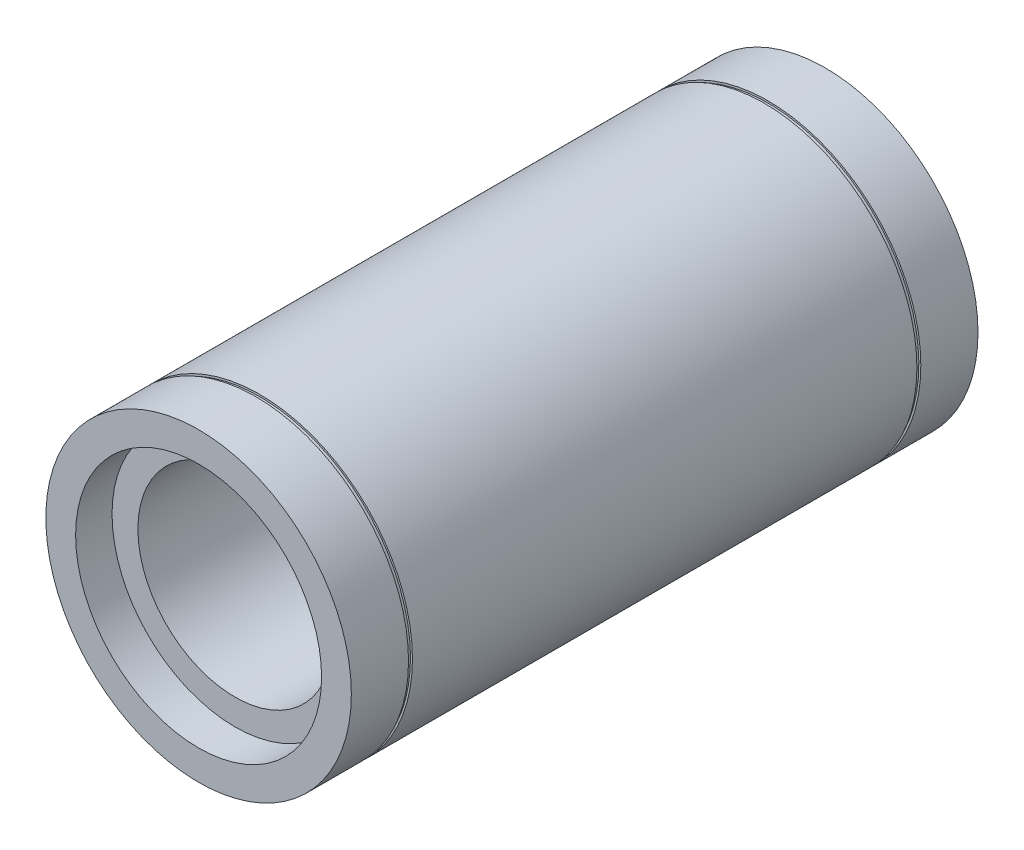
ISO-10303-21;
HEADER;
FILE_DESCRIPTION(('STEP AP214'),'2;1');
FILE_NAME('part.step','',(''),(''),'','','');
FILE_SCHEMA(('AUTOMOTIVE_DESIGN { 1 0 10303 214 1 1 1 1 }'));
ENDSEC;
DATA;
#1=APPLICATION_CONTEXT('core data for automotive mechanical design processes');
#2=APPLICATION_PROTOCOL_DEFINITION('international standard','automotive_design',2000,#1);
#3=PRODUCT_CONTEXT('',#1,'mechanical');
#4=PRODUCT('Part','Part','',(#3));
#5=PRODUCT_RELATED_PRODUCT_CATEGORY('part','',(#4));
#6=PRODUCT_DEFINITION_FORMATION('','',#4);
#7=PRODUCT_DEFINITION_CONTEXT('part definition',#1,'design');
#8=PRODUCT_DEFINITION('design','',#6,#7);
#9=PRODUCT_DEFINITION_SHAPE('','',#8);
#10=(LENGTH_UNIT() NAMED_UNIT(*) SI_UNIT(.MILLI.,.METRE.));
#11=(NAMED_UNIT(*) PLANE_ANGLE_UNIT() SI_UNIT($,.RADIAN.));
#12=(NAMED_UNIT(*) SI_UNIT($,.STERADIAN.) SOLID_ANGLE_UNIT());
#13=UNCERTAINTY_MEASURE_WITH_UNIT(LENGTH_MEASURE(1.E-05),#10,'distance_accuracy_value','');
#14=(GEOMETRIC_REPRESENTATION_CONTEXT(3) GLOBAL_UNCERTAINTY_ASSIGNED_CONTEXT((#13)) GLOBAL_UNIT_ASSIGNED_CONTEXT((#10,
#11,#12)) REPRESENTATION_CONTEXT('',''));
#15=CARTESIAN_POINT('',(0.,0.,0.));
#16=DIRECTION('',(0.,0.,1.));
#17=DIRECTION('',(1.,0.,0.));
#18=AXIS2_PLACEMENT_3D('',#15,#16,#17);
#19=CARTESIAN_POINT('',(0.,0.,16.));
#20=DIRECTION('',(0.,0.,-1.));
#21=DIRECTION('',(-1.,0.,0.));
#22=AXIS2_PLACEMENT_3D('',#19,#20,#21);
#23=CYLINDRICAL_SURFACE('',#22,2.48);
#24=CARTESIAN_POINT('',(0.,0.,0.93));
#25=DIRECTION('',(0.,0.,1.));
#26=DIRECTION('',(1.,0.,0.));
#27=AXIS2_PLACEMENT_3D('',#24,#25,#26);
#28=CIRCLE('',#27,2.48);
#29=CARTESIAN_POINT('',(2.48,0.,0.93));
#30=VERTEX_POINT('',#29);
#31=EDGE_CURVE('E228',#30,#30,#28,.T.);
#32=ORIENTED_EDGE('',*,*,#31,.F.);
#33=EDGE_LOOP('',(#32));
#34=FACE_BOUND('',#33,.T.);
#35=CARTESIAN_POINT('',(0.,0.,7.07));
#36=DIRECTION('',(0.,0.,1.));
#37=DIRECTION('',(1.,0.,0.));
#38=AXIS2_PLACEMENT_3D('',#35,#36,#37);
#39=CIRCLE('',#38,2.48);
#40=CARTESIAN_POINT('',(2.48,0.,7.07));
#41=VERTEX_POINT('',#40);
#42=EDGE_CURVE('E79',#41,#41,#39,.T.);
#43=ORIENTED_EDGE('',*,*,#42,.T.);
#44=EDGE_LOOP('',(#43));
#45=FACE_BOUND('',#44,.T.);
#46=ADVANCED_FACE('F75',(#34,#45),#23,.F.);
#47=CARTESIAN_POINT('',(0.,0.,15.07));
#48=DIRECTION('',(0.,0.,1.));
#49=DIRECTION('',(1.,0.,0.));
#50=AXIS2_PLACEMENT_3D('',#47,#48,#49);
#51=CIRCLE('',#50,2.48);
#52=CARTESIAN_POINT('',(2.48,0.,15.07));
#53=VERTEX_POINT('',#52);
#54=EDGE_CURVE('E235',#53,#53,#51,.T.);
#55=ORIENTED_EDGE('',*,*,#54,.T.);
#56=EDGE_LOOP('',(#55));
#57=FACE_BOUND('',#56,.T.);
#58=CARTESIAN_POINT('',(0.,0.,8.93));
#59=DIRECTION('',(0.,0.,-1.));
#60=DIRECTION('',(-1.,0.,0.));
#61=AXIS2_PLACEMENT_3D('',#58,#59,#60);
#62=CIRCLE('',#61,2.48);
#63=CARTESIAN_POINT('',(-2.48,0.,8.93));
#64=VERTEX_POINT('',#63);
#65=EDGE_CURVE('E189',#64,#64,#62,.T.);
#66=ORIENTED_EDGE('',*,*,#65,.T.);
#67=EDGE_LOOP('',(#66));
#68=FACE_BOUND('',#67,.T.);
#69=ADVANCED_FACE('F273',(#57,#68),#23,.F.);
#70=CARTESIAN_POINT('',(0.,0.,0.));
#71=DIRECTION('',(0.,0.,1.));
#72=DIRECTION('',(1.,0.,0.));
#73=AXIS2_PLACEMENT_3D('',#70,#71,#72);
#74=PLANE('',#73);
#75=CARTESIAN_POINT('',(0.,0.,0.));
#76=DIRECTION('',(0.,0.,1.));
#77=DIRECTION('',(1.,0.,0.));
#78=AXIS2_PLACEMENT_3D('',#75,#76,#77);
#79=CIRCLE('',#78,3.9);
#80=CARTESIAN_POINT('',(3.9,0.,0.));
#81=VERTEX_POINT('',#80);
#82=EDGE_CURVE('E84',#81,#81,#79,.T.);
#83=ORIENTED_EDGE('',*,*,#82,.F.);
#84=EDGE_LOOP('',(#83));
#85=FACE_BOUND('',#84,.T.);
#86=CARTESIAN_POINT('',(0.,0.,0.));
#87=DIRECTION('',(0.,0.,1.));
#88=DIRECTION('',(1.,0.,0.));
#89=AXIS2_PLACEMENT_3D('',#86,#87,#88);
#90=CIRCLE('',#89,3.14);
#91=CARTESIAN_POINT('',(3.14,0.,0.));
#92=VERTEX_POINT('',#91);
#93=EDGE_CURVE('E231',#92,#92,#90,.T.);
#94=ORIENTED_EDGE('',*,*,#93,.T.);
#95=EDGE_LOOP('',(#94));
#96=FACE_BOUND('',#95,.T.);
#97=ADVANCED_FACE('F279',(#85,#96),#74,.F.);
#98=CARTESIAN_POINT('',(0.,0.,16.));
#99=DIRECTION('',(0.,0.,1.));
#100=DIRECTION('',(1.,0.,0.));
#101=AXIS2_PLACEMENT_3D('',#98,#99,#100);
#102=PLANE('',#101);
#103=CARTESIAN_POINT('',(0.,0.,16.));
#104=DIRECTION('',(0.,0.,1.));
#105=DIRECTION('',(1.,0.,0.));
#106=AXIS2_PLACEMENT_3D('',#103,#104,#105);
#107=CIRCLE('',#106,3.14);
#108=CARTESIAN_POINT('',(3.14,0.,16.));
#109=VERTEX_POINT('',#108);
#110=EDGE_CURVE('E240',#109,#109,#107,.T.);
#111=ORIENTED_EDGE('',*,*,#110,.F.);
#112=EDGE_LOOP('',(#111));
#113=FACE_BOUND('',#112,.T.);
#114=CARTESIAN_POINT('',(0.,0.,16.));
#115=DIRECTION('',(0.,0.,1.));
#116=DIRECTION('',(1.,0.,0.));
#117=AXIS2_PLACEMENT_3D('',#114,#115,#116);
#118=CIRCLE('',#117,3.9);
#119=CARTESIAN_POINT('',(3.9,0.,16.));
#120=VERTEX_POINT('',#119);
#121=EDGE_CURVE('E13',#120,#120,#118,.T.);
#122=ORIENTED_EDGE('',*,*,#121,.T.);
#123=EDGE_LOOP('',(#122));
#124=FACE_BOUND('',#123,.T.);
#125=ADVANCED_FACE('F286',(#113,#124),#102,.T.);
#126=CARTESIAN_POINT('',(0.,0.,16.));
#127=DIRECTION('',(0.,0.,-1.));
#128=DIRECTION('',(-1.,0.,0.));
#129=AXIS2_PLACEMENT_3D('',#126,#127,#128);
#130=CYLINDRICAL_SURFACE('',#129,3.9);
#131=CARTESIAN_POINT('',(0.,0.,14.54));
#132=DIRECTION('',(0.,0.,-1.));
#133=DIRECTION('',(-0.539347709413305,-0.842083159997052,0.));
#134=AXIS2_PLACEMENT_3D('',#131,#132,#133);
#135=CIRCLE('',#134,3.9);
#136=CARTESIAN_POINT('',(-2.10717899288575,-3.28173684075079,14.54));
#137=VERTEX_POINT('',#136);
#138=CARTESIAN_POINT('',(-2.10345606671189,-3.2841243239885,14.54));
#139=VERTEX_POINT('',#138);
#140=EDGE_CURVE('E175',#137,#139,#135,.T.);
#141=ORIENTED_EDGE('',*,*,#140,.F.);
#142=DIRECTION('',(0.,0.,-1.));
#143=VECTOR('',#142,1.);
#144=CARTESIAN_POINT('',(-2.10717899288574,-3.2817368407508,14.54));
#145=LINE('',#144,#143);
#146=CARTESIAN_POINT('',(-2.10717899288574,-3.2817368407508,14.44));
#147=VERTEX_POINT('',#146);
#148=EDGE_CURVE('E92',#137,#147,#145,.T.);
#149=ORIENTED_EDGE('',*,*,#148,.T.);
#150=CARTESIAN_POINT('',(0.,0.,14.44));
#151=DIRECTION('',(0.,0.,-1.));
#152=DIRECTION('',(-0.539347709413305,-0.842083159997052,0.));
#153=AXIS2_PLACEMENT_3D('',#150,#151,#152);
#154=CIRCLE('',#153,3.9);
#155=CARTESIAN_POINT('',(-2.10345606671189,-3.2841243239885,14.44));
#156=VERTEX_POINT('',#155);
#157=EDGE_CURVE('E148',#147,#156,#154,.T.);
#158=ORIENTED_EDGE('',*,*,#157,.T.);
#159=DIRECTION('',(0.,0.,1.));
#160=VECTOR('',#159,1.);
#161=CARTESIAN_POINT('',(-2.10345606671189,-3.2841243239885,14.44));
#162=LINE('',#161,#160);
#163=EDGE_CURVE('E179',#156,#139,#162,.T.);
#164=ORIENTED_EDGE('',*,*,#163,.T.);
#165=EDGE_LOOP('',(#141,#149,#158,#164));
#166=FACE_BOUND('',#165,.T.);
#167=DIRECTION('',(0.,0.,-1.));
#168=VECTOR('',#167,1.);
#169=CARTESIAN_POINT('',(-2.10717899288574,-3.2817368407508,1.56));
#170=LINE('',#169,#168);
#171=CARTESIAN_POINT('',(-2.10717899288574,-3.2817368407508,1.56));
#172=VERTEX_POINT('',#171);
#173=CARTESIAN_POINT('',(-2.10717899288575,-3.28173684075079,1.46));
#174=VERTEX_POINT('',#173);
#175=EDGE_CURVE('E199',#172,#174,#170,.T.);
#176=ORIENTED_EDGE('',*,*,#175,.T.);
#177=CARTESIAN_POINT('',(0.,0.,1.46));
#178=DIRECTION('',(0.,0.,-1.));
#179=DIRECTION('',(-0.539347709413305,-0.842083159997052,0.));
#180=AXIS2_PLACEMENT_3D('',#177,#178,#179);
#181=CIRCLE('',#180,3.9);
#182=CARTESIAN_POINT('',(-2.10345606671189,-3.2841243239885,1.46));
#183=VERTEX_POINT('',#182);
#184=EDGE_CURVE('E195',#174,#183,#181,.T.);
#185=ORIENTED_EDGE('',*,*,#184,.T.);
#186=DIRECTION('',(0.,0.,1.));
#187=VECTOR('',#186,1.);
#188=CARTESIAN_POINT('',(-2.10345606671189,-3.2841243239885,1.46));
#189=LINE('',#188,#187);
#190=CARTESIAN_POINT('',(-2.10345606671189,-3.2841243239885,1.56));
#191=VERTEX_POINT('',#190);
#192=EDGE_CURVE('E191',#183,#191,#189,.T.);
#193=ORIENTED_EDGE('',*,*,#192,.T.);
#194=CARTESIAN_POINT('',(0.,0.,1.56));
#195=DIRECTION('',(0.,0.,-1.));
#196=DIRECTION('',(-0.539347709413305,-0.842083159997052,0.));
#197=AXIS2_PLACEMENT_3D('',#194,#195,#196);
#198=CIRCLE('',#197,3.9);
#199=EDGE_CURVE('E100',#172,#191,#198,.T.);
#200=ORIENTED_EDGE('',*,*,#199,.F.);
#201=EDGE_LOOP('',(#176,#185,#193,#200));
#202=FACE_BOUND('',#201,.T.);
#203=ORIENTED_EDGE('',*,*,#121,.F.);
#204=EDGE_LOOP('',(#203));
#205=FACE_BOUND('',#204,.T.);
#206=ORIENTED_EDGE('',*,*,#82,.T.);
#207=EDGE_LOOP('',(#206));
#208=FACE_BOUND('',#207,.T.);
#209=ADVANCED_FACE('F77',(#166,#202,#205,#208),#130,.T.);
#210=CARTESIAN_POINT('',(0.,0.,15.07));
#211=DIRECTION('',(0.,0.,1.));
#212=DIRECTION('',(1.,0.,0.));
#213=AXIS2_PLACEMENT_3D('',#210,#211,#212);
#214=CYLINDRICAL_SURFACE('',#213,3.14);
#215=CARTESIAN_POINT('',(0.,0.,15.07));
#216=DIRECTION('',(0.,0.,1.));
#217=DIRECTION('',(1.,0.,0.));
#218=AXIS2_PLACEMENT_3D('',#215,#216,#217);
#219=CIRCLE('',#218,3.14);
#220=CARTESIAN_POINT('',(3.14,0.,15.07));
#221=VERTEX_POINT('',#220);
#222=EDGE_CURVE('E241',#221,#221,#219,.T.);
#223=ORIENTED_EDGE('',*,*,#222,.F.);
#224=EDGE_LOOP('',(#223));
#225=FACE_BOUND('',#224,.T.);
#226=ORIENTED_EDGE('',*,*,#110,.T.);
#227=EDGE_LOOP('',(#226));
#228=FACE_BOUND('',#227,.T.);
#229=ADVANCED_FACE('F284',(#225,#228),#214,.F.);
#230=CARTESIAN_POINT('',(0.,0.,15.07));
#231=DIRECTION('',(0.,0.,1.));
#232=DIRECTION('',(1.,0.,0.));
#233=AXIS2_PLACEMENT_3D('',#230,#231,#232);
#234=PLANE('',#233);
#235=ORIENTED_EDGE('',*,*,#54,.F.);
#236=EDGE_LOOP('',(#235));
#237=FACE_BOUND('',#236,.T.);
#238=ORIENTED_EDGE('',*,*,#222,.T.);
#239=EDGE_LOOP('',(#238));
#240=FACE_BOUND('',#239,.T.);
#241=ADVANCED_FACE('F303',(#237,#240),#234,.T.);
#242=CARTESIAN_POINT('',(0.,0.,0.93));
#243=DIRECTION('',(0.,0.,1.));
#244=DIRECTION('',(1.,0.,0.));
#245=AXIS2_PLACEMENT_3D('',#242,#243,#244);
#246=PLANE('',#245);
#247=CARTESIAN_POINT('',(0.,0.,0.93));
#248=DIRECTION('',(0.,0.,1.));
#249=DIRECTION('',(1.,0.,0.));
#250=AXIS2_PLACEMENT_3D('',#247,#248,#249);
#251=CIRCLE('',#250,3.14);
#252=CARTESIAN_POINT('',(3.14,0.,0.93));
#253=VERTEX_POINT('',#252);
#254=EDGE_CURVE('E232',#253,#253,#251,.T.);
#255=ORIENTED_EDGE('',*,*,#254,.F.);
#256=EDGE_LOOP('',(#255));
#257=FACE_BOUND('',#256,.T.);
#258=ORIENTED_EDGE('',*,*,#31,.T.);
#259=EDGE_LOOP('',(#258));
#260=FACE_BOUND('',#259,.T.);
#261=ADVANCED_FACE('F267',(#257,#260),#246,.F.);
#262=CARTESIAN_POINT('',(0.,0.,0.93));
#263=DIRECTION('',(0.,0.,-1.));
#264=DIRECTION('',(-1.,0.,0.));
#265=AXIS2_PLACEMENT_3D('',#262,#263,#264);
#266=CYLINDRICAL_SURFACE('',#265,3.14);
#267=ORIENTED_EDGE('',*,*,#254,.T.);
#268=EDGE_LOOP('',(#267));
#269=FACE_BOUND('',#268,.T.);
#270=ORIENTED_EDGE('',*,*,#93,.F.);
#271=EDGE_LOOP('',(#270));
#272=FACE_BOUND('',#271,.T.);
#273=ADVANCED_FACE('F258',(#269,#272),#266,.F.);
#274=CARTESIAN_POINT('',(0.,0.,8.));
#275=DIRECTION('',(0.,0.,-1.));
#276=DIRECTION('',(-1.,0.,0.));
#277=AXIS2_PLACEMENT_3D('',#274,#275,#276);
#278=TOROIDAL_SURFACE('',#277,2.48,0.93);
#279=ORIENTED_EDGE('',*,*,#42,.F.);
#280=EDGE_LOOP('',(#279));
#281=FACE_BOUND('',#280,.T.);
#282=ORIENTED_EDGE('',*,*,#65,.F.);
#283=EDGE_LOOP('',(#282));
#284=FACE_BOUND('',#283,.T.);
#285=ADVANCED_FACE('F254',(#281,#284),#278,.F.);
#286=CARTESIAN_POINT('',(0.,0.,1.46));
#287=DIRECTION('',(0.,0.,1.));
#288=DIRECTION('',(1.,0.,0.));
#289=AXIS2_PLACEMENT_3D('',#286,#287,#288);
#290=PLANE('',#289);
#291=DIRECTION('',(-0.539347709413305,-0.842083159997052,0.));
#292=VECTOR('',#291,1.);
#293=CARTESIAN_POINT('',(-2.10345606671189,-3.2841243239885,1.46));
#294=LINE('',#293,#292);
#295=CARTESIAN_POINT('',(-2.07648868124122,-3.24202016598865,1.46));
#296=VERTEX_POINT('',#295);
#297=EDGE_CURVE('E187',#296,#183,#294,.T.);
#298=ORIENTED_EDGE('',*,*,#297,.T.);
#299=ORIENTED_EDGE('',*,*,#184,.F.);
#300=DIRECTION('',(-0.54030230586814,-0.841470984807896,0.));
#301=VECTOR('',#300,1.);
#302=CARTESIAN_POINT('',(-2.10717899288575,-3.28173684075079,1.46));
#303=LINE('',#302,#301);
#304=CARTESIAN_POINT('',(-2.08016387759234,-3.2396632915104,1.46));
#305=VERTEX_POINT('',#304);
#306=EDGE_CURVE('E224',#305,#174,#303,.T.);
#307=ORIENTED_EDGE('',*,*,#306,.F.);
#308=CARTESIAN_POINT('',(0.,0.,1.46));
#309=DIRECTION('',(0.,0.,-1.));
#310=DIRECTION('',(-1.,0.,0.));
#311=AXIS2_PLACEMENT_3D('',#308,#309,#310);
#312=CIRCLE('',#311,3.85);
#313=EDGE_CURVE('E215',#305,#296,#312,.T.);
#314=ORIENTED_EDGE('',*,*,#313,.T.);
#315=EDGE_LOOP('',(#298,#299,#307,#314));
#316=FACE_BOUND('',#315,.T.);
#317=ADVANCED_FACE('F257',(#316),#290,.T.);
#318=CARTESIAN_POINT('',(-2.10717899288574,-3.2817368407508,1.51));
#319=DIRECTION('',(-0.841470984807897,0.54030230586814,0.));
#320=DIRECTION('',(0.,0.,-1.));
#321=AXIS2_PLACEMENT_3D('',#318,#319,#320);
#322=PLANE('',#321);
#323=ORIENTED_EDGE('',*,*,#306,.T.);
#324=ORIENTED_EDGE('',*,*,#175,.F.);
#325=DIRECTION('',(-0.54030230586814,-0.841470984807897,0.));
#326=VECTOR('',#325,1.);
#327=CARTESIAN_POINT('',(-2.10717899288574,-3.2817368407508,1.56));
#328=LINE('',#327,#326);
#329=CARTESIAN_POINT('',(-2.08016387759234,-3.2396632915104,1.56));
#330=VERTEX_POINT('',#329);
#331=EDGE_CURVE('E222',#330,#172,#328,.T.);
#332=ORIENTED_EDGE('',*,*,#331,.F.);
#333=DIRECTION('',(0.,0.,-1.));
#334=VECTOR('',#333,1.);
#335=CARTESIAN_POINT('',(-2.08016387759234,-3.2396632915104,16.));
#336=LINE('',#335,#334);
#337=EDGE_CURVE('E206',#330,#305,#336,.T.);
#338=ORIENTED_EDGE('',*,*,#337,.T.);
#339=EDGE_LOOP('',(#323,#324,#332,#338));
#340=FACE_BOUND('',#339,.T.);
#341=ADVANCED_FACE('F264',(#340),#322,.T.);
#342=CARTESIAN_POINT('',(0.,0.,1.56));
#343=DIRECTION('',(0.,0.,1.));
#344=DIRECTION('',(1.,0.,0.));
#345=AXIS2_PLACEMENT_3D('',#342,#343,#344);
#346=PLANE('',#345);
#347=ORIENTED_EDGE('',*,*,#331,.T.);
#348=ORIENTED_EDGE('',*,*,#199,.T.);
#349=DIRECTION('',(-0.539347709413305,-0.842083159997052,0.));
#350=VECTOR('',#349,1.);
#351=CARTESIAN_POINT('',(-2.10345606671189,-3.2841243239885,1.56));
#352=LINE('',#351,#350);
#353=CARTESIAN_POINT('',(-2.07648868124122,-3.24202016598865,1.56));
#354=VERTEX_POINT('',#353);
#355=EDGE_CURVE('E203',#354,#191,#352,.T.);
#356=ORIENTED_EDGE('',*,*,#355,.F.);
#357=CARTESIAN_POINT('',(0.,0.,1.56));
#358=DIRECTION('',(0.,0.,-1.));
#359=DIRECTION('',(-1.,0.,0.));
#360=AXIS2_PLACEMENT_3D('',#357,#358,#359);
#361=CIRCLE('',#360,3.85);
#362=EDGE_CURVE('E207',#330,#354,#361,.T.);
#363=ORIENTED_EDGE('',*,*,#362,.F.);
#364=EDGE_LOOP('',(#347,#348,#356,#363));
#365=FACE_BOUND('',#364,.T.);
#366=ADVANCED_FACE('F320',(#365),#346,.F.);
#367=CARTESIAN_POINT('',(-2.10345606671189,-3.2841243239885,1.51));
#368=DIRECTION('',(0.842083159997052,-0.539347709413305,0.));
#369=DIRECTION('',(0.,0.,1.));
#370=AXIS2_PLACEMENT_3D('',#367,#368,#369);
#371=PLANE('',#370);
#372=DIRECTION('',(0.,0.,-1.));
#373=VECTOR('',#372,1.);
#374=CARTESIAN_POINT('',(-2.07648868124122,-3.24202016598865,16.));
#375=LINE('',#374,#373);
#376=EDGE_CURVE('E211',#296,#354,#375,.F.);
#377=ORIENTED_EDGE('',*,*,#376,.T.);
#378=ORIENTED_EDGE('',*,*,#355,.T.);
#379=ORIENTED_EDGE('',*,*,#192,.F.);
#380=ORIENTED_EDGE('',*,*,#297,.F.);
#381=EDGE_LOOP('',(#377,#378,#379,#380));
#382=FACE_BOUND('',#381,.T.);
#383=ADVANCED_FACE('F319',(#382),#371,.T.);
#384=CARTESIAN_POINT('',(0.,0.,16.));
#385=DIRECTION('',(0.,0.,-1.));
#386=DIRECTION('',(-1.,0.,0.));
#387=AXIS2_PLACEMENT_3D('',#384,#385,#386);
#388=CYLINDRICAL_SURFACE('',#387,3.85);
#389=ORIENTED_EDGE('',*,*,#362,.T.);
#390=ORIENTED_EDGE('',*,*,#376,.F.);
#391=ORIENTED_EDGE('',*,*,#313,.F.);
#392=ORIENTED_EDGE('',*,*,#337,.F.);
#393=EDGE_LOOP('',(#389,#390,#391,#392));
#394=FACE_BOUND('',#393,.T.);
#395=ADVANCED_FACE('F322',(#394),#388,.T.);
#396=CARTESIAN_POINT('',(-2.10717899288574,-3.2817368407508,14.49));
#397=DIRECTION('',(-0.841470984807897,0.54030230586814,0.));
#398=DIRECTION('',(0.,0.,-1.));
#399=AXIS2_PLACEMENT_3D('',#396,#397,#398);
#400=PLANE('',#399);
#401=DIRECTION('',(0.54030230586814,0.841470984807896,0.));
#402=VECTOR('',#401,1.);
#403=CARTESIAN_POINT('',(-2.10717899288575,-3.28173684075079,14.54));
#404=LINE('',#403,#402);
#405=CARTESIAN_POINT('',(-2.08016387759234,-3.2396632915104,14.54));
#406=VERTEX_POINT('',#405);
#407=EDGE_CURVE('E149',#137,#406,#404,.T.);
#408=ORIENTED_EDGE('',*,*,#407,.T.);
#409=DIRECTION('',(0.,0.,-1.));
#410=VECTOR('',#409,1.);
#411=CARTESIAN_POINT('',(-2.08016387759234,-3.2396632915104,16.));
#412=LINE('',#411,#410);
#413=CARTESIAN_POINT('',(-2.08016387759234,-3.2396632915104,14.44));
#414=VERTEX_POINT('',#413);
#415=EDGE_CURVE('E153',#406,#414,#412,.T.);
#416=ORIENTED_EDGE('',*,*,#415,.T.);
#417=DIRECTION('',(0.54030230586814,0.841470984807897,0.));
#418=VECTOR('',#417,1.);
#419=CARTESIAN_POINT('',(-2.10717899288574,-3.2817368407508,14.44));
#420=LINE('',#419,#418);
#421=EDGE_CURVE('E142',#147,#414,#420,.T.);
#422=ORIENTED_EDGE('',*,*,#421,.F.);
#423=ORIENTED_EDGE('',*,*,#148,.F.);
#424=EDGE_LOOP('',(#408,#416,#422,#423));
#425=FACE_BOUND('',#424,.T.);
#426=ADVANCED_FACE('F154',(#425),#400,.T.);
#427=CARTESIAN_POINT('',(0.,0.,14.44));
#428=DIRECTION('',(0.,0.,1.));
#429=DIRECTION('',(1.,0.,0.));
#430=AXIS2_PLACEMENT_3D('',#427,#428,#429);
#431=PLANE('',#430);
#432=ORIENTED_EDGE('',*,*,#421,.T.);
#433=CARTESIAN_POINT('',(0.,0.,14.44));
#434=DIRECTION('',(0.,0.,-1.));
#435=DIRECTION('',(-1.,0.,0.));
#436=AXIS2_PLACEMENT_3D('',#433,#434,#435);
#437=CIRCLE('',#436,3.85);
#438=CARTESIAN_POINT('',(-2.07648868124122,-3.24202016598865,14.44));
#439=VERTEX_POINT('',#438);
#440=EDGE_CURVE('E146',#414,#439,#437,.T.);
#441=ORIENTED_EDGE('',*,*,#440,.T.);
#442=DIRECTION('',(0.539347709413305,0.842083159997052,0.));
#443=VECTOR('',#442,1.);
#444=CARTESIAN_POINT('',(-2.10345606671189,-3.2841243239885,14.44));
#445=LINE('',#444,#443);
#446=EDGE_CURVE('E150',#156,#439,#445,.T.);
#447=ORIENTED_EDGE('',*,*,#446,.F.);
#448=ORIENTED_EDGE('',*,*,#157,.F.);
#449=EDGE_LOOP('',(#432,#441,#447,#448));
#450=FACE_BOUND('',#449,.T.);
#451=ADVANCED_FACE('F144',(#450),#431,.T.);
#452=CARTESIAN_POINT('',(-2.10345606671189,-3.2841243239885,14.49));
#453=DIRECTION('',(0.842083159997052,-0.539347709413305,0.));
#454=DIRECTION('',(0.,0.,1.));
#455=AXIS2_PLACEMENT_3D('',#452,#453,#454);
#456=PLANE('',#455);
#457=ORIENTED_EDGE('',*,*,#446,.T.);
#458=DIRECTION('',(0.,0.,-1.));
#459=VECTOR('',#458,1.);
#460=CARTESIAN_POINT('',(-2.07648868124122,-3.24202016598865,16.));
#461=LINE('',#460,#459);
#462=CARTESIAN_POINT('',(-2.07648868124122,-3.24202016598865,14.54));
#463=VERTEX_POINT('',#462);
#464=EDGE_CURVE('E164',#439,#463,#461,.F.);
#465=ORIENTED_EDGE('',*,*,#464,.T.);
#466=DIRECTION('',(0.539347709413305,0.842083159997052,0.));
#467=VECTOR('',#466,1.);
#468=CARTESIAN_POINT('',(-2.10345606671189,-3.2841243239885,14.54));
#469=LINE('',#468,#467);
#470=EDGE_CURVE('E166',#139,#463,#469,.T.);
#471=ORIENTED_EDGE('',*,*,#470,.F.);
#472=ORIENTED_EDGE('',*,*,#163,.F.);
#473=EDGE_LOOP('',(#457,#465,#471,#472));
#474=FACE_BOUND('',#473,.T.);
#475=ADVANCED_FACE('F367',(#474),#456,.T.);
#476=CARTESIAN_POINT('',(0.,0.,14.54));
#477=DIRECTION('',(0.,0.,1.));
#478=DIRECTION('',(1.,0.,0.));
#479=AXIS2_PLACEMENT_3D('',#476,#477,#478);
#480=PLANE('',#479);
#481=ORIENTED_EDGE('',*,*,#140,.T.);
#482=ORIENTED_EDGE('',*,*,#470,.T.);
#483=CARTESIAN_POINT('',(0.,0.,14.54));
#484=DIRECTION('',(0.,0.,-1.));
#485=DIRECTION('',(-1.,0.,0.));
#486=AXIS2_PLACEMENT_3D('',#483,#484,#485);
#487=CIRCLE('',#486,3.85);
#488=EDGE_CURVE('E159',#406,#463,#487,.T.);
#489=ORIENTED_EDGE('',*,*,#488,.F.);
#490=ORIENTED_EDGE('',*,*,#407,.F.);
#491=EDGE_LOOP('',(#481,#482,#489,#490));
#492=FACE_BOUND('',#491,.T.);
#493=ADVANCED_FACE('F332',(#492),#480,.F.);
#494=CARTESIAN_POINT('',(0.,0.,16.));
#495=DIRECTION('',(0.,0.,-1.));
#496=DIRECTION('',(-1.,0.,0.));
#497=AXIS2_PLACEMENT_3D('',#494,#495,#496);
#498=CYLINDRICAL_SURFACE('',#497,3.85);
#499=ORIENTED_EDGE('',*,*,#464,.F.);
#500=ORIENTED_EDGE('',*,*,#440,.F.);
#501=ORIENTED_EDGE('',*,*,#415,.F.);
#502=ORIENTED_EDGE('',*,*,#488,.T.);
#503=EDGE_LOOP('',(#499,#500,#501,#502));
#504=FACE_BOUND('',#503,.T.);
#505=ADVANCED_FACE('F162',(#504),#498,.T.);
#506=CLOSED_SHELL('',(#46,#69,#97,#125,#209,#229,#241,#261,#273,#285,#317,#341,#366,#383,#395,
#426,#451,#475,#493,#505));
#507=MANIFOLD_SOLID_BREP('B2',#506);
#508=ADVANCED_BREP_SHAPE_REPRESENTATION('',(#18,#507),#14);
#509=SHAPE_DEFINITION_REPRESENTATION(#9,#508);
ENDSEC;
END-ISO-10303-21;
